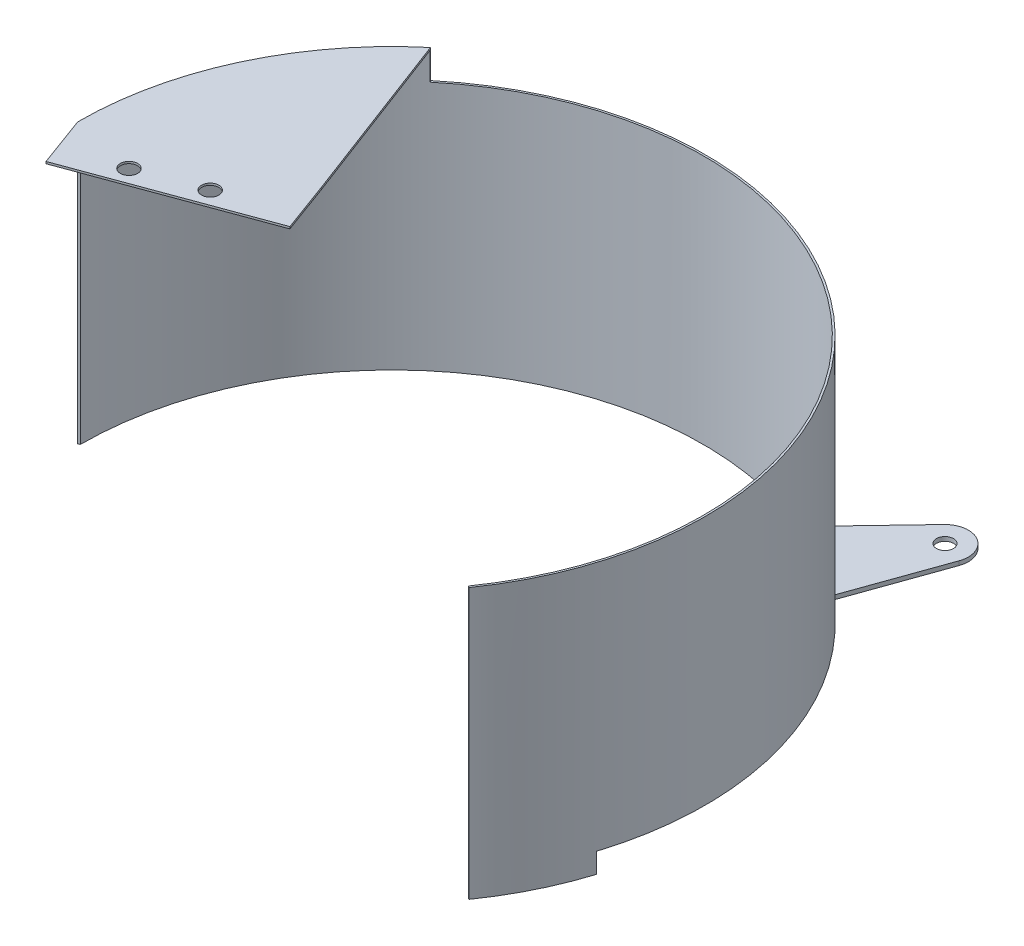
ISO-10303-21;
HEADER;
FILE_DESCRIPTION(('STEP AP214'),'2;1');
FILE_NAME('part.step','',(''),(''),'','','');
FILE_SCHEMA(('AUTOMOTIVE_DESIGN { 1 0 10303 214 1 1 1 1 }'));
ENDSEC;
DATA;
#1=APPLICATION_CONTEXT('core data for automotive mechanical design processes');
#2=APPLICATION_PROTOCOL_DEFINITION('international standard','automotive_design',2000,#1);
#3=PRODUCT_CONTEXT('',#1,'mechanical');
#4=PRODUCT('Part','Part','',(#3));
#5=PRODUCT_RELATED_PRODUCT_CATEGORY('part','',(#4));
#6=PRODUCT_DEFINITION_FORMATION('','',#4);
#7=PRODUCT_DEFINITION_CONTEXT('part definition',#1,'design');
#8=PRODUCT_DEFINITION('design','',#6,#7);
#9=PRODUCT_DEFINITION_SHAPE('','',#8);
#10=(LENGTH_UNIT() NAMED_UNIT(*) SI_UNIT(.MILLI.,.METRE.));
#11=(NAMED_UNIT(*) PLANE_ANGLE_UNIT() SI_UNIT($,.RADIAN.));
#12=(NAMED_UNIT(*) SI_UNIT($,.STERADIAN.) SOLID_ANGLE_UNIT());
#13=UNCERTAINTY_MEASURE_WITH_UNIT(LENGTH_MEASURE(1.E-05),#10,'distance_accuracy_value','');
#14=(GEOMETRIC_REPRESENTATION_CONTEXT(3) GLOBAL_UNCERTAINTY_ASSIGNED_CONTEXT((#13)) GLOBAL_UNIT_ASSIGNED_CONTEXT((#10,
#11,#12)) REPRESENTATION_CONTEXT('',''));
#15=CARTESIAN_POINT('',(0.,0.,0.));
#16=DIRECTION('',(0.,0.,1.));
#17=DIRECTION('',(1.,0.,0.));
#18=AXIS2_PLACEMENT_3D('',#15,#16,#17);
#19=CARTESIAN_POINT('',(-119.379693575983,7.61999999999996,0.2704842037125));
#20=DIRECTION('',(0.344827586206966,0.,0.938666040607988));
#21=DIRECTION('',(0.938666040607988,0.,-0.344827586206966));
#22=AXIS2_PLACEMENT_3D('',#19,#20,#21);
#23=PLANE('',#22);
#24=DIRECTION('',(0.,-1.,0.));
#25=VECTOR('',#24,1.);
#26=CARTESIAN_POINT('',(-118.6434,102.87,0.));
#27=LINE('',#26,#25);
#28=CARTESIAN_POINT('',(-118.6434,113.03,0.));
#29=VERTEX_POINT('',#28);
#30=CARTESIAN_POINT('',(-118.6434,7.61999999999996,0.));
#31=VERTEX_POINT('',#30);
#32=EDGE_CURVE('E345',#29,#31,#27,.T.);
#33=ORIENTED_EDGE('',*,*,#32,.F.);
#34=DIRECTION('',(0.938666040607988,0.,-0.344827586206966));
#35=VECTOR('',#34,1.);
#36=CARTESIAN_POINT('',(-119.379693575983,113.03,0.270484203712493));
#37=LINE('',#36,#35);
#38=CARTESIAN_POINT('',(-119.379693575983,113.03,0.2704842037125));
#39=VERTEX_POINT('',#38);
#40=EDGE_CURVE('E73',#39,#29,#37,.T.);
#41=ORIENTED_EDGE('',*,*,#40,.F.);
#42=DIRECTION('',(0.,1.,0.));
#43=VECTOR('',#42,1.);
#44=CARTESIAN_POINT('',(-119.379693575983,7.61999999999996,0.2704842037125));
#45=LINE('',#44,#43);
#46=CARTESIAN_POINT('',(-119.379693575983,7.61999999999996,0.2704842037125));
#47=VERTEX_POINT('',#46);
#48=EDGE_CURVE('E307',#47,#39,#45,.T.);
#49=ORIENTED_EDGE('',*,*,#48,.F.);
#50=DIRECTION('',(0.938666040607988,0.,-0.344827586206966));
#51=VECTOR('',#50,1.);
#52=CARTESIAN_POINT('',(-119.379693575983,7.61999999999996,0.2704842037125));
#53=LINE('',#52,#51);
#54=EDGE_CURVE('E303',#47,#31,#53,.T.);
#55=ORIENTED_EDGE('',*,*,#54,.T.);
#56=EDGE_LOOP('',(#33,#41,#49,#55));
#57=FACE_BOUND('',#56,.T.);
#58=ADVANCED_FACE('F46',(#57),#23,.T.);
#59=CARTESIAN_POINT('',(-8.68307739513456E-12,113.03,-4.05590009722013E-12));
#60=DIRECTION('',(0.,-1.,0.));
#61=DIRECTION('',(0.,0.,-1.));
#62=AXIS2_PLACEMENT_3D('',#59,#60,#61);
#63=PLANE('',#62);
#64=DIRECTION('',(-0.354304631179803,0.,-0.935130059577032));
#65=VECTOR('',#64,1.);
#66=CARTESIAN_POINT('',(-51.440692330775,113.03,-24.6875315284033));
#67=LINE('',#66,#65);
#68=CARTESIAN_POINT('',(-76.4594448936933,113.03,-90.7205029202786));
#69=VERTEX_POINT('',#68);
#70=CARTESIAN_POINT('',(-76.7359848443851,113.03,-91.4503856195385));
#71=VERTEX_POINT('',#70);
#72=EDGE_CURVE('E11',#69,#71,#67,.T.);
#73=ORIENTED_EDGE('',*,*,#72,.F.);
#74=CARTESIAN_POINT('',(-8.68307739513456E-12,113.03,-4.05590009722013E-12));
#75=DIRECTION('',(0.,-1.,0.));
#76=DIRECTION('',(0.,0.,-1.));
#77=AXIS2_PLACEMENT_3D('',#74,#75,#76);
#78=CIRCLE('',#77,118.643399999991);
#79=CARTESIAN_POINT('',(-76.26250749109,113.03,-90.8861172827371));
#80=VERTEX_POINT('',#79);
#81=EDGE_CURVE('E288',#69,#80,#78,.T.);
#82=ORIENTED_EDGE('',*,*,#81,.T.);
#83=DIRECTION('',(-0.642787609686567,0.,-0.766044443118955));
#84=VECTOR('',#83,1.);
#85=CARTESIAN_POINT('',(-76.7359848443851,113.03,-91.4503856195385));
#86=LINE('',#85,#84);
#87=EDGE_CURVE('E287',#80,#71,#86,.T.);
#88=ORIENTED_EDGE('',*,*,#87,.T.);
#89=EDGE_LOOP('',(#73,#82,#88));
#90=FACE_BOUND('',#89,.T.);
#91=ADVANCED_FACE('F406',(#90),#63,.F.);
#92=CARTESIAN_POINT('',(0.,102.87,0.));
#93=DIRECTION('',(0.,-1.,0.));
#94=DIRECTION('',(0.,0.,-1.));
#95=AXIS2_PLACEMENT_3D('',#92,#93,#94);
#96=CYLINDRICAL_SURFACE('',#95,118.6434);
#97=CARTESIAN_POINT('',(0.,7.62,0.));
#98=DIRECTION('',(0.,-1.,0.));
#99=DIRECTION('',(0.,0.,-1.));
#100=AXIS2_PLACEMENT_3D('',#97,#98,#99);
#101=CIRCLE('',#100,118.6434);
#102=CARTESIAN_POINT('',(113.152221674402,7.62,35.6767584529046));
#103=VERTEX_POINT('',#102);
#104=EDGE_CURVE('E326',#31,#103,#101,.T.);
#105=ORIENTED_EDGE('',*,*,#104,.T.);
#106=DIRECTION('',(0.,-1.,0.));
#107=VECTOR('',#106,1.);
#108=CARTESIAN_POINT('',(113.152221674402,7.62,35.6767584529046));
#109=LINE('',#108,#107);
#110=CARTESIAN_POINT('',(113.152221674402,0.,35.6767584529049));
#111=VERTEX_POINT('',#110);
#112=EDGE_CURVE('E310',#103,#111,#109,.T.);
#113=ORIENTED_EDGE('',*,*,#112,.T.);
#114=CARTESIAN_POINT('',(0.,0.,0.));
#115=DIRECTION('',(0.,1.,0.));
#116=DIRECTION('',(1.,0.,0.));
#117=AXIS2_PLACEMENT_3D('',#114,#115,#116);
#118=CIRCLE('',#117,118.6434);
#119=CARTESIAN_POINT('',(97.186983651397,0.,68.0510585685711));
#120=VERTEX_POINT('',#119);
#121=EDGE_CURVE('E330',#111,#120,#118,.F.);
#122=ORIENTED_EDGE('',*,*,#121,.T.);
#123=DIRECTION('',(0.,-1.,0.));
#124=VECTOR('',#123,1.);
#125=CARTESIAN_POINT('',(97.186983651397,102.87,68.0510585685711));
#126=LINE('',#125,#124);
#127=CARTESIAN_POINT('',(97.186983651397,102.87,68.0510585685711));
#128=VERTEX_POINT('',#127);
#129=EDGE_CURVE('E56',#128,#120,#126,.T.);
#130=ORIENTED_EDGE('',*,*,#129,.F.);
#131=CARTESIAN_POINT('',(0.,102.87,0.));
#132=DIRECTION('',(0.,1.,0.));
#133=DIRECTION('',(1.,0.,0.));
#134=AXIS2_PLACEMENT_3D('',#131,#132,#133);
#135=CIRCLE('',#134,118.6434);
#136=CARTESIAN_POINT('',(-76.26250749109,102.87,-90.8861172827371));
#137=VERTEX_POINT('',#136);
#138=EDGE_CURVE('E334',#137,#128,#135,.F.);
#139=ORIENTED_EDGE('',*,*,#138,.F.);
#140=DIRECTION('',(0.,-1.,0.));
#141=VECTOR('',#140,1.);
#142=CARTESIAN_POINT('',(-76.26250749109,113.03,-90.8861172827371));
#143=LINE('',#142,#141);
#144=EDGE_CURVE('E299',#80,#137,#143,.T.);
#145=ORIENTED_EDGE('',*,*,#144,.F.);
#146=ORIENTED_EDGE('',*,*,#81,.F.);
#147=EDGE_CURVE('E283',#29,#69,#78,.T.);
#148=ORIENTED_EDGE('',*,*,#147,.F.);
#149=ORIENTED_EDGE('',*,*,#32,.T.);
#150=EDGE_LOOP('',(#105,#113,#122,#130,#139,#145,#146,#148,#149));
#151=FACE_BOUND('',#150,.T.);
#152=ADVANCED_FACE('F48',(#151),#96,.F.);
#153=CARTESIAN_POINT('',(0.,102.87,0.));
#154=DIRECTION('',(0.,-1.,0.));
#155=DIRECTION('',(0.,0.,-1.));
#156=AXIS2_PLACEMENT_3D('',#153,#154,#155);
#157=CYLINDRICAL_SURFACE('',#156,119.38);
#158=DIRECTION('',(0.,-1.,0.));
#159=VECTOR('',#158,1.);
#160=CARTESIAN_POINT('',(76.0548796235913,9.2075,-92.0176053015999));
#161=LINE('',#160,#159);
#162=CARTESIAN_POINT('',(76.0548796235913,9.2075,-92.0176053015999));
#163=VERTEX_POINT('',#162);
#164=CARTESIAN_POINT('',(76.0548796235913,7.62,-92.0176053015999));
#165=VERTEX_POINT('',#164);
#166=EDGE_CURVE('E194',#163,#165,#161,.T.);
#167=ORIENTED_EDGE('',*,*,#166,.F.);
#168=CARTESIAN_POINT('',(0.,9.2075,0.));
#169=DIRECTION('',(0.,1.,0.));
#170=DIRECTION('',(0.,0.,-1.));
#171=AXIS2_PLACEMENT_3D('',#168,#169,#170);
#172=CIRCLE('',#171,119.38);
#173=CARTESIAN_POINT('',(47.938477771701,9.2075,-109.332002400633));
#174=VERTEX_POINT('',#173);
#175=EDGE_CURVE('E185',#163,#174,#172,.T.);
#176=ORIENTED_EDGE('',*,*,#175,.T.);
#177=DIRECTION('',(0.,-1.,0.));
#178=VECTOR('',#177,1.);
#179=CARTESIAN_POINT('',(47.938477771701,9.2075,-109.332002400633));
#180=LINE('',#179,#178);
#181=CARTESIAN_POINT('',(47.938477771701,7.62,-109.332002400633));
#182=VERTEX_POINT('',#181);
#183=EDGE_CURVE('E168',#174,#182,#180,.T.);
#184=ORIENTED_EDGE('',*,*,#183,.T.);
#185=CARTESIAN_POINT('',(0.,7.62,0.));
#186=DIRECTION('',(0.,-1.,0.));
#187=DIRECTION('',(0.,0.,-1.));
#188=AXIS2_PLACEMENT_3D('',#185,#186,#187);
#189=CIRCLE('',#188,119.38);
#190=EDGE_CURVE('E331',#47,#182,#189,.T.);
#191=ORIENTED_EDGE('',*,*,#190,.F.);
#192=ORIENTED_EDGE('',*,*,#48,.T.);
#193=DIRECTION('',(0.,-1.,0.));
#194=VECTOR('',#193,1.);
#195=CARTESIAN_POINT('',(-119.379693575983,113.792,0.270484203712493));
#196=LINE('',#195,#194);
#197=CARTESIAN_POINT('',(-119.379693575983,113.792,0.2704842037125));
#198=VERTEX_POINT('',#197);
#199=EDGE_CURVE('E244',#198,#39,#196,.T.);
#200=ORIENTED_EDGE('',*,*,#199,.F.);
#201=CARTESIAN_POINT('',(-8.00748356510894E-12,113.792,-3.740063814206E-12));
#202=DIRECTION('',(0.,1.,0.));
#203=DIRECTION('',(0.,0.,-1.));
#204=AXIS2_PLACEMENT_3D('',#201,#202,#203);
#205=CIRCLE('',#204,119.379999999992);
#206=CARTESIAN_POINT('',(-76.7359848443851,113.792,-91.4503856195385));
#207=VERTEX_POINT('',#206);
#208=EDGE_CURVE('E265',#207,#198,#205,.T.);
#209=ORIENTED_EDGE('',*,*,#208,.F.);
#210=DIRECTION('',(0.,-1.,0.));
#211=VECTOR('',#210,1.);
#212=CARTESIAN_POINT('',(-76.7359848443851,113.792,-91.4503856195385));
#213=LINE('',#212,#211);
#214=EDGE_CURVE('E271',#207,#71,#213,.T.);
#215=ORIENTED_EDGE('',*,*,#214,.T.);
#216=DIRECTION('',(0.,-1.,0.));
#217=VECTOR('',#216,1.);
#218=CARTESIAN_POINT('',(-76.7359848443851,113.03,-91.4503856195385));
#219=LINE('',#218,#217);
#220=CARTESIAN_POINT('',(-76.7359848443851,102.87,-91.4503856195385));
#221=VERTEX_POINT('',#220);
#222=EDGE_CURVE('E292',#71,#221,#219,.T.);
#223=ORIENTED_EDGE('',*,*,#222,.T.);
#224=CARTESIAN_POINT('',(0.,102.87,0.));
#225=DIRECTION('',(0.,-1.,0.));
#226=DIRECTION('',(0.,0.,-1.));
#227=AXIS2_PLACEMENT_3D('',#224,#225,#226);
#228=CIRCLE('',#227,119.38);
#229=CARTESIAN_POINT('',(97.7903710472203,102.87,68.4735549715873));
#230=VERTEX_POINT('',#229);
#231=EDGE_CURVE('E342',#221,#230,#228,.T.);
#232=ORIENTED_EDGE('',*,*,#231,.T.);
#233=DIRECTION('',(0.,-1.,0.));
#234=VECTOR('',#233,1.);
#235=CARTESIAN_POINT('',(97.7903710472203,102.87,68.4735549715873));
#236=LINE('',#235,#234);
#237=CARTESIAN_POINT('',(97.7903710472203,0.,68.4735549715873));
#238=VERTEX_POINT('',#237);
#239=EDGE_CURVE('E356',#230,#238,#236,.T.);
#240=ORIENTED_EDGE('',*,*,#239,.T.);
#241=CARTESIAN_POINT('',(0.,0.,0.));
#242=DIRECTION('',(0.,-1.,0.));
#243=DIRECTION('',(0.,0.,-1.));
#244=AXIS2_PLACEMENT_3D('',#241,#242,#243);
#245=CIRCLE('',#244,119.38);
#246=CARTESIAN_POINT('',(113.854729580324,0.,35.8982583448194));
#247=VERTEX_POINT('',#246);
#248=EDGE_CURVE('E338',#247,#238,#245,.T.);
#249=ORIENTED_EDGE('',*,*,#248,.F.);
#250=DIRECTION('',(0.,-1.,0.));
#251=VECTOR('',#250,1.);
#252=CARTESIAN_POINT('',(113.854729580324,102.87,35.8982583448194));
#253=LINE('',#252,#251);
#254=CARTESIAN_POINT('',(113.854729580324,7.62,35.8982583448194));
#255=VERTEX_POINT('',#254);
#256=EDGE_CURVE('E311',#255,#247,#253,.T.);
#257=ORIENTED_EDGE('',*,*,#256,.F.);
#258=EDGE_CURVE('E322',#165,#255,#189,.T.);
#259=ORIENTED_EDGE('',*,*,#258,.F.);
#260=EDGE_LOOP('',(#167,#176,#184,#191,#192,#200,#209,#215,#223,#232,#240,#249,#257,#259));
#261=FACE_BOUND('',#260,.T.);
#262=ADVANCED_FACE('F192',(#261),#157,.T.);
#263=CARTESIAN_POINT('',(0.,0.,0.));
#264=DIRECTION('',(0.,1.,0.));
#265=DIRECTION('',(1.,0.,0.));
#266=AXIS2_PLACEMENT_3D('',#263,#264,#265);
#267=PLANE('',#266);
#268=DIRECTION('',(-0.953716950748228,0.,-0.30070579950427));
#269=VECTOR('',#268,1.);
#270=CARTESIAN_POINT('',(113.152221674402,0.,35.6767584529049));
#271=LINE('',#270,#269);
#272=EDGE_CURVE('E318',#111,#247,#271,.F.);
#273=ORIENTED_EDGE('',*,*,#272,.T.);
#274=ORIENTED_EDGE('',*,*,#248,.T.);
#275=DIRECTION('',(-0.819152044289029,0.,-0.573576436350992));
#276=VECTOR('',#275,1.);
#277=CARTESIAN_POINT('',(97.7903710472203,0.,68.4735549715873));
#278=LINE('',#277,#276);
#279=EDGE_CURVE('E348',#238,#120,#278,.T.);
#280=ORIENTED_EDGE('',*,*,#279,.T.);
#281=ORIENTED_EDGE('',*,*,#121,.F.);
#282=EDGE_LOOP('',(#273,#274,#280,#281));
#283=FACE_BOUND('',#282,.T.);
#284=ADVANCED_FACE('F422',(#283),#267,.F.);
#285=CARTESIAN_POINT('',(97.7903710472203,102.87,68.4735549715873));
#286=DIRECTION('',(-0.573576436350992,0.,0.81915204428903));
#287=DIRECTION('',(0.81915204428903,0.,0.573576436350992));
#288=AXIS2_PLACEMENT_3D('',#285,#286,#287);
#289=PLANE('',#288);
#290=ORIENTED_EDGE('',*,*,#279,.F.);
#291=ORIENTED_EDGE('',*,*,#239,.F.);
#292=DIRECTION('',(-0.819152044289029,0.,-0.573576436350992));
#293=VECTOR('',#292,1.);
#294=CARTESIAN_POINT('',(97.7903710472203,102.87,68.4735549715873));
#295=LINE('',#294,#293);
#296=EDGE_CURVE('E337',#230,#128,#295,.T.);
#297=ORIENTED_EDGE('',*,*,#296,.T.);
#298=ORIENTED_EDGE('',*,*,#129,.T.);
#299=EDGE_LOOP('',(#290,#291,#297,#298));
#300=FACE_BOUND('',#299,.T.);
#301=ADVANCED_FACE('F418',(#300),#289,.T.);
#302=CARTESIAN_POINT('',(0.,102.87,0.));
#303=DIRECTION('',(0.,1.,0.));
#304=DIRECTION('',(1.,0.,0.));
#305=AXIS2_PLACEMENT_3D('',#302,#303,#304);
#306=PLANE('',#305);
#307=DIRECTION('',(-0.642787609686567,0.,-0.766044443118955));
#308=VECTOR('',#307,1.);
#309=CARTESIAN_POINT('',(-76.7359848443851,102.87,-91.4503856195385));
#310=LINE('',#309,#308);
#311=EDGE_CURVE('E282',#137,#221,#310,.T.);
#312=ORIENTED_EDGE('',*,*,#311,.F.);
#313=ORIENTED_EDGE('',*,*,#138,.T.);
#314=ORIENTED_EDGE('',*,*,#296,.F.);
#315=ORIENTED_EDGE('',*,*,#231,.F.);
#316=EDGE_LOOP('',(#312,#313,#314,#315));
#317=FACE_BOUND('',#316,.T.);
#318=ADVANCED_FACE('F415',(#317),#306,.T.);
#319=CARTESIAN_POINT('',(0.,7.62,0.));
#320=DIRECTION('',(0.,1.,0.));
#321=DIRECTION('',(0.,0.,1.));
#322=AXIS2_PLACEMENT_3D('',#319,#320,#321);
#323=PLANE('',#322);
#324=ORIENTED_EDGE('',*,*,#104,.F.);
#325=ORIENTED_EDGE('',*,*,#54,.F.);
#326=ORIENTED_EDGE('',*,*,#190,.T.);
#327=DIRECTION('',(0.690007892958849,0.,-0.723801842809542));
#328=VECTOR('',#327,1.);
#329=CARTESIAN_POINT('',(73.8609896705439,7.62,-136.524099873863));
#330=LINE('',#329,#328);
#331=CARTESIAN_POINT('',(73.8609896705439,7.62,-136.524099873863));
#332=VERTEX_POINT('',#331);
#333=EDGE_CURVE('E173',#182,#332,#330,.T.);
#334=ORIENTED_EDGE('',*,*,#333,.T.);
#335=CARTESIAN_POINT('',(80.2955880531208,7.62,-130.389929705459));
#336=DIRECTION('',(0.,-1.,0.));
#337=DIRECTION('',(0.,0.,1.));
#338=AXIS2_PLACEMENT_3D('',#335,#336,#337);
#339=CIRCLE('',#338,8.89);
#340=CARTESIAN_POINT('',(88.6694516172861,7.62,-127.404882133184));
#341=VERTEX_POINT('',#340);
#342=EDGE_CURVE('E199',#332,#341,#339,.T.);
#343=ORIENTED_EDGE('',*,*,#342,.T.);
#344=DIRECTION('',(-0.335775879895944,0.,0.94194190823007));
#345=VECTOR('',#344,1.);
#346=CARTESIAN_POINT('',(76.0548796235913,7.62,-92.0176053015999));
#347=LINE('',#346,#345);
#348=EDGE_CURVE('E65',#341,#165,#347,.T.);
#349=ORIENTED_EDGE('',*,*,#348,.T.);
#350=ORIENTED_EDGE('',*,*,#258,.T.);
#351=DIRECTION('',(-0.953716950748229,0.,-0.300705799504267));
#352=VECTOR('',#351,1.);
#353=CARTESIAN_POINT('',(113.152221674402,7.62,35.6767584529046));
#354=LINE('',#353,#352);
#355=EDGE_CURVE('E314',#103,#255,#354,.F.);
#356=ORIENTED_EDGE('',*,*,#355,.F.);
#357=EDGE_LOOP('',(#324,#325,#326,#334,#343,#349,#350,#356));
#358=FACE_BOUND('',#357,.T.);
#359=CARTESIAN_POINT('',(80.2955880531208,7.62,-130.389929705459));
#360=DIRECTION('',(0.,-1.,0.));
#361=DIRECTION('',(0.,0.,-1.));
#362=AXIS2_PLACEMENT_3D('',#359,#360,#361);
#363=CIRCLE('',#362,3.26389999999999);
#364=CARTESIAN_POINT('',(80.2955880531208,7.62,-133.653829705459));
#365=VERTEX_POINT('',#364);
#366=EDGE_CURVE('E202',#365,#365,#363,.T.);
#367=ORIENTED_EDGE('',*,*,#366,.F.);
#368=EDGE_LOOP('',(#367));
#369=FACE_BOUND('',#368,.T.);
#370=ADVANCED_FACE('F429',(#358,#369),#323,.F.);
#371=CARTESIAN_POINT('',(113.152221674402,3.81,35.6767584529046));
#372=DIRECTION('',(-0.300705799504267,0.,0.953716950748229));
#373=DIRECTION('',(0.,-1.,0.));
#374=AXIS2_PLACEMENT_3D('',#371,#372,#373);
#375=PLANE('',#374);
#376=ORIENTED_EDGE('',*,*,#272,.F.);
#377=ORIENTED_EDGE('',*,*,#112,.F.);
#378=ORIENTED_EDGE('',*,*,#355,.T.);
#379=ORIENTED_EDGE('',*,*,#256,.T.);
#380=EDGE_LOOP('',(#376,#377,#378,#379));
#381=FACE_BOUND('',#380,.T.);
#382=ADVANCED_FACE('F425',(#381),#375,.F.);
#383=CARTESIAN_POINT('',(-76.7359848443851,113.03,-91.4503856195385));
#384=DIRECTION('',(-0.766044443118955,0.,0.642787609686567));
#385=DIRECTION('',(0.642787609686567,0.,0.766044443118955));
#386=AXIS2_PLACEMENT_3D('',#383,#384,#385);
#387=PLANE('',#386);
#388=ORIENTED_EDGE('',*,*,#311,.T.);
#389=ORIENTED_EDGE('',*,*,#222,.F.);
#390=ORIENTED_EDGE('',*,*,#87,.F.);
#391=ORIENTED_EDGE('',*,*,#144,.T.);
#392=EDGE_LOOP('',(#388,#389,#390,#391));
#393=FACE_BOUND('',#392,.T.);
#394=ADVANCED_FACE('F404',(#393),#387,.F.);
#395=CARTESIAN_POINT('',(-51.440692330775,113.792,-24.6875315284033));
#396=DIRECTION('',(-0.935130059577032,0.,0.354304631179803));
#397=DIRECTION('',(0.354304631179803,0.,0.935130059577032));
#398=AXIS2_PLACEMENT_3D('',#395,#396,#397);
#399=PLANE('',#398);
#400=CARTESIAN_POINT('',(-51.440692330775,113.03,-24.6875315284033));
#401=VERTEX_POINT('',#400);
#402=EDGE_CURVE('E58',#401,#69,#67,.T.);
#403=ORIENTED_EDGE('',*,*,#402,.T.);
#404=ORIENTED_EDGE('',*,*,#72,.T.);
#405=ORIENTED_EDGE('',*,*,#214,.F.);
#406=DIRECTION('',(-0.354304631179803,0.,-0.935130059577032));
#407=VECTOR('',#406,1.);
#408=CARTESIAN_POINT('',(-51.440692330775,113.792,-24.6875315284033));
#409=LINE('',#408,#407);
#410=CARTESIAN_POINT('',(-51.440692330775,113.792,-24.6875315284033));
#411=VERTEX_POINT('',#410);
#412=EDGE_CURVE('E269',#411,#207,#409,.T.);
#413=ORIENTED_EDGE('',*,*,#412,.F.);
#414=DIRECTION('',(0.,-1.,0.));
#415=VECTOR('',#414,1.);
#416=CARTESIAN_POINT('',(-51.440692330775,113.792,-24.6875315284033));
#417=LINE('',#416,#415);
#418=EDGE_CURVE('E278',#411,#401,#417,.T.);
#419=ORIENTED_EDGE('',*,*,#418,.T.);
#420=EDGE_LOOP('',(#403,#404,#405,#413,#419));
#421=FACE_BOUND('',#420,.T.);
#422=ADVANCED_FACE('F387',(#421),#399,.F.);
#423=CARTESIAN_POINT('',(-8.00748356510894E-12,113.792,-3.740063814206E-12));
#424=DIRECTION('',(0.,-1.,0.));
#425=DIRECTION('',(0.,0.,-1.));
#426=AXIS2_PLACEMENT_3D('',#423,#424,#425);
#427=PLANE('',#426);
#428=CARTESIAN_POINT('',(-94.2586622610647,113.792,5.86092858076518));
#429=DIRECTION('',(0.,1.,0.));
#430=DIRECTION('',(0.,0.,1.));
#431=AXIS2_PLACEMENT_3D('',#428,#429,#430);
#432=CIRCLE('',#431,3.30000000000001);
#433=CARTESIAN_POINT('',(-94.2586622610647,113.792,9.16092858076519));
#434=VERTEX_POINT('',#433);
#435=EDGE_CURVE('E222',#434,#434,#432,.T.);
#436=ORIENTED_EDGE('',*,*,#435,.F.);
#437=EDGE_LOOP('',(#436));
#438=FACE_BOUND('',#437,.T.);
#439=CARTESIAN_POINT('',(-71.6339672349805,113.792,-2.45049328494983));
#440=DIRECTION('',(0.,1.,0.));
#441=DIRECTION('',(0.,0.,1.));
#442=AXIS2_PLACEMENT_3D('',#439,#440,#441);
#443=CIRCLE('',#442,3.29999999999999);
#444=CARTESIAN_POINT('',(-71.6339672349805,113.792,0.849506715050158));
#445=VERTEX_POINT('',#444);
#446=EDGE_CURVE('E216',#445,#445,#443,.T.);
#447=ORIENTED_EDGE('',*,*,#446,.F.);
#448=EDGE_LOOP('',(#447));
#449=FACE_BOUND('',#448,.T.);
#450=ORIENTED_EDGE('',*,*,#208,.T.);
#451=DIRECTION('',(-0.344827586206966,0.,-0.938666040607989));
#452=VECTOR('',#451,1.);
#453=CARTESIAN_POINT('',(-112.366400603568,113.792,19.361590047227));
#454=LINE('',#453,#452);
#455=CARTESIAN_POINT('',(-112.366400603568,113.792,19.361590047227));
#456=VERTEX_POINT('',#455);
#457=EDGE_CURVE('E243',#456,#198,#454,.T.);
#458=ORIENTED_EDGE('',*,*,#457,.F.);
#459=DIRECTION('',(-0.938666040607988,0.,0.344827586206966));
#460=VECTOR('',#459,1.);
#461=CARTESIAN_POINT('',(-112.366400603568,113.792,19.361590047227));
#462=LINE('',#461,#460);
#463=CARTESIAN_POINT('',(-44.4273993583598,113.792,-5.59642568488879));
#464=VERTEX_POINT('',#463);
#465=EDGE_CURVE('E240',#464,#456,#462,.T.);
#466=ORIENTED_EDGE('',*,*,#465,.F.);
#467=DIRECTION('',(-0.344827586206966,0.,-0.938666040607989));
#468=VECTOR('',#467,1.);
#469=CARTESIAN_POINT('',(-44.4273993583598,113.792,-5.59642568488879));
#470=LINE('',#469,#468);
#471=EDGE_CURVE('E253',#464,#411,#470,.T.);
#472=ORIENTED_EDGE('',*,*,#471,.T.);
#473=ORIENTED_EDGE('',*,*,#412,.T.);
#474=EDGE_LOOP('',(#450,#458,#466,#472,#473));
#475=FACE_BOUND('',#474,.T.);
#476=ADVANCED_FACE('F379',(#438,#449,#475),#427,.F.);
#477=CARTESIAN_POINT('',(-8.00748356510894E-12,113.03,-3.740063814206E-12));
#478=DIRECTION('',(0.,-1.,0.));
#479=DIRECTION('',(0.,0.,-1.));
#480=AXIS2_PLACEMENT_3D('',#477,#478,#479);
#481=PLANE('',#480);
#482=CARTESIAN_POINT('',(-94.2586622610647,113.03,5.86092858076518));
#483=DIRECTION('',(0.,-1.,0.));
#484=DIRECTION('',(0.,0.,-1.));
#485=AXIS2_PLACEMENT_3D('',#482,#483,#484);
#486=CIRCLE('',#485,3.30000000000001);
#487=CARTESIAN_POINT('',(-94.2586622610647,113.03,9.16092858076519));
#488=VERTEX_POINT('',#487);
#489=EDGE_CURVE('E50',#488,#488,#486,.T.);
#490=ORIENTED_EDGE('',*,*,#489,.F.);
#491=EDGE_LOOP('',(#490));
#492=FACE_BOUND('',#491,.T.);
#493=CARTESIAN_POINT('',(-71.6339672349805,113.03,-2.45049328494983));
#494=DIRECTION('',(0.,-1.,0.));
#495=DIRECTION('',(0.,0.,-1.));
#496=AXIS2_PLACEMENT_3D('',#493,#494,#495);
#497=CIRCLE('',#496,3.29999999999999);
#498=CARTESIAN_POINT('',(-71.6339672349805,113.03,0.849506715050158));
#499=VERTEX_POINT('',#498);
#500=EDGE_CURVE('E226',#499,#499,#497,.T.);
#501=ORIENTED_EDGE('',*,*,#500,.F.);
#502=EDGE_LOOP('',(#501));
#503=FACE_BOUND('',#502,.T.);
#504=ORIENTED_EDGE('',*,*,#402,.F.);
#505=DIRECTION('',(-0.344827586206966,0.,-0.938666040607989));
#506=VECTOR('',#505,1.);
#507=CARTESIAN_POINT('',(-44.4273993583598,113.03,-5.59642568488879));
#508=LINE('',#507,#506);
#509=CARTESIAN_POINT('',(-44.4273993583598,113.03,-5.59642568488879));
#510=VERTEX_POINT('',#509);
#511=EDGE_CURVE('E257',#510,#401,#508,.T.);
#512=ORIENTED_EDGE('',*,*,#511,.F.);
#513=DIRECTION('',(0.938666040607988,0.,-0.344827586206966));
#514=VECTOR('',#513,1.);
#515=CARTESIAN_POINT('',(-112.366400603568,113.03,19.361590047227));
#516=LINE('',#515,#514);
#517=CARTESIAN_POINT('',(-112.366400603568,113.03,19.361590047227));
#518=VERTEX_POINT('',#517);
#519=EDGE_CURVE('E234',#518,#510,#516,.T.);
#520=ORIENTED_EDGE('',*,*,#519,.F.);
#521=DIRECTION('',(-0.344827586206966,0.,-0.938666040607989));
#522=VECTOR('',#521,1.);
#523=CARTESIAN_POINT('',(-112.366400603568,113.03,19.361590047227));
#524=LINE('',#523,#522);
#525=EDGE_CURVE('E261',#518,#39,#524,.T.);
#526=ORIENTED_EDGE('',*,*,#525,.T.);
#527=ORIENTED_EDGE('',*,*,#40,.T.);
#528=ORIENTED_EDGE('',*,*,#147,.T.);
#529=EDGE_LOOP('',(#504,#512,#520,#526,#527,#528));
#530=FACE_BOUND('',#529,.T.);
#531=ADVANCED_FACE('F375',(#492,#503,#530),#481,.T.);
#532=CARTESIAN_POINT('',(-112.366400603568,113.792,19.361590047227));
#533=DIRECTION('',(0.938666040607989,0.,-0.344827586206966));
#534=DIRECTION('',(-0.344827586206966,0.,-0.938666040607989));
#535=AXIS2_PLACEMENT_3D('',#532,#533,#534);
#536=PLANE('',#535);
#537=ORIENTED_EDGE('',*,*,#199,.T.);
#538=ORIENTED_EDGE('',*,*,#525,.F.);
#539=DIRECTION('',(0.,-1.,0.));
#540=VECTOR('',#539,1.);
#541=CARTESIAN_POINT('',(-112.366400603568,113.792,19.361590047227));
#542=LINE('',#541,#540);
#543=EDGE_CURVE('E230',#456,#518,#542,.T.);
#544=ORIENTED_EDGE('',*,*,#543,.F.);
#545=ORIENTED_EDGE('',*,*,#457,.T.);
#546=EDGE_LOOP('',(#537,#538,#544,#545));
#547=FACE_BOUND('',#546,.T.);
#548=ADVANCED_FACE('F378',(#547),#536,.F.);
#549=CARTESIAN_POINT('',(-44.4273993583598,113.792,-5.59642568488879));
#550=DIRECTION('',(-0.938666040607989,0.,0.344827586206966));
#551=DIRECTION('',(0.344827586206966,0.,0.938666040607989));
#552=AXIS2_PLACEMENT_3D('',#549,#550,#551);
#553=PLANE('',#552);
#554=ORIENTED_EDGE('',*,*,#418,.F.);
#555=ORIENTED_EDGE('',*,*,#471,.F.);
#556=DIRECTION('',(0.,1.,0.));
#557=VECTOR('',#556,1.);
#558=CARTESIAN_POINT('',(-44.4273993583598,113.792,-5.59642568488879));
#559=LINE('',#558,#557);
#560=EDGE_CURVE('E237',#510,#464,#559,.T.);
#561=ORIENTED_EDGE('',*,*,#560,.F.);
#562=ORIENTED_EDGE('',*,*,#511,.T.);
#563=EDGE_LOOP('',(#554,#555,#561,#562));
#564=FACE_BOUND('',#563,.T.);
#565=ADVANCED_FACE('F391',(#564),#553,.F.);
#566=CARTESIAN_POINT('',(-7.09412676599711,0.,-19.3111460607242));
#567=DIRECTION('',(0.344827586206966,0.,0.938666040607989));
#568=DIRECTION('',(0.938666040607989,0.,-0.344827586206966));
#569=AXIS2_PLACEMENT_3D('',#566,#567,#568);
#570=PLANE('',#569);
#571=ORIENTED_EDGE('',*,*,#543,.T.);
#572=ORIENTED_EDGE('',*,*,#519,.T.);
#573=ORIENTED_EDGE('',*,*,#560,.T.);
#574=ORIENTED_EDGE('',*,*,#465,.T.);
#575=EDGE_LOOP('',(#571,#572,#573,#574));
#576=FACE_BOUND('',#575,.T.);
#577=ADVANCED_FACE('F394',(#576),#570,.T.);
#578=CARTESIAN_POINT('',(-71.6339672349805,0.,-2.45049328494983));
#579=DIRECTION('',(0.,1.,0.));
#580=DIRECTION('',(0.,0.,1.));
#581=AXIS2_PLACEMENT_3D('',#578,#579,#580);
#582=CYLINDRICAL_SURFACE('',#581,3.29999999999999);
#583=CARTESIAN_POINT('',(-71.6339672349805,113.03,0.849506715050158));
#584=CARTESIAN_POINT('',(-71.6339672349805,113.0379375,0.849506715050158));
#585=CARTESIAN_POINT('',(-71.6339672349805,113.045875,0.849506715050158));
#586=CARTESIAN_POINT('',(-71.6339672349805,113.06175,0.849506715050158));
#587=CARTESIAN_POINT('',(-71.6339672349805,113.0696875,0.849506715050158));
#588=CARTESIAN_POINT('',(-71.6339672349805,113.0855625,0.849506715050158));
#589=CARTESIAN_POINT('',(-71.6339672349805,113.0935,0.849506715050158));
#590=CARTESIAN_POINT('',(-71.6339672349805,113.109375,0.849506715050158));
#591=CARTESIAN_POINT('',(-71.6339672349805,113.1173125,0.849506715050158));
#592=CARTESIAN_POINT('',(-71.6339672349805,113.1331875,0.849506715050158));
#593=CARTESIAN_POINT('',(-71.6339672349805,113.141125,0.849506715050158));
#594=CARTESIAN_POINT('',(-71.6339672349805,113.157,0.849506715050158));
#595=CARTESIAN_POINT('',(-71.6339672349805,113.1649375,0.849506715050158));
#596=CARTESIAN_POINT('',(-71.6339672349805,113.1808125,0.849506715050158));
#597=CARTESIAN_POINT('',(-71.6339672349805,113.18875,0.849506715050158));
#598=CARTESIAN_POINT('',(-71.6339672349805,113.204625,0.849506715050158));
#599=CARTESIAN_POINT('',(-71.6339672349805,113.2125625,0.849506715050158));
#600=CARTESIAN_POINT('',(-71.6339672349805,113.2284375,0.849506715050158));
#601=CARTESIAN_POINT('',(-71.6339672349805,113.236375,0.849506715050158));
#602=CARTESIAN_POINT('',(-71.6339672349805,113.25225,0.849506715050158));
#603=CARTESIAN_POINT('',(-71.6339672349805,113.2601875,0.849506715050158));
#604=CARTESIAN_POINT('',(-71.6339672349805,113.2760625,0.849506715050158));
#605=CARTESIAN_POINT('',(-71.6339672349805,113.284,0.849506715050158));
#606=CARTESIAN_POINT('',(-71.6339672349805,113.299875,0.849506715050158));
#607=CARTESIAN_POINT('',(-71.6339672349805,113.3078125,0.849506715050158));
#608=CARTESIAN_POINT('',(-71.6339672349805,113.3236875,0.849506715050158));
#609=CARTESIAN_POINT('',(-71.6339672349805,113.331625,0.849506715050158));
#610=CARTESIAN_POINT('',(-71.6339672349805,113.3475,0.849506715050158));
#611=CARTESIAN_POINT('',(-71.6339672349805,113.3554375,0.849506715050158));
#612=CARTESIAN_POINT('',(-71.6339672349805,113.3713125,0.849506715050158));
#613=CARTESIAN_POINT('',(-71.6339672349805,113.37925,0.849506715050158));
#614=CARTESIAN_POINT('',(-71.6339672349805,113.395125,0.849506715050158));
#615=CARTESIAN_POINT('',(-71.6339672349805,113.4030625,0.849506715050158));
#616=CARTESIAN_POINT('',(-71.6339672349805,113.4189375,0.849506715050158));
#617=CARTESIAN_POINT('',(-71.6339672349805,113.426875,0.849506715050158));
#618=CARTESIAN_POINT('',(-71.6339672349805,113.44275,0.849506715050158));
#619=CARTESIAN_POINT('',(-71.6339672349805,113.4506875,0.849506715050158));
#620=CARTESIAN_POINT('',(-71.6339672349805,113.4665625,0.849506715050158));
#621=CARTESIAN_POINT('',(-71.6339672349805,113.4745,0.849506715050158));
#622=CARTESIAN_POINT('',(-71.6339672349805,113.490375,0.849506715050158));
#623=CARTESIAN_POINT('',(-71.6339672349805,113.4983125,0.849506715050158));
#624=CARTESIAN_POINT('',(-71.6339672349805,113.5141875,0.849506715050158));
#625=CARTESIAN_POINT('',(-71.6339672349805,113.522125,0.849506715050158));
#626=CARTESIAN_POINT('',(-71.6339672349805,113.538,0.849506715050158));
#627=CARTESIAN_POINT('',(-71.6339672349805,113.5459375,0.849506715050158));
#628=CARTESIAN_POINT('',(-71.6339672349805,113.5618125,0.849506715050158));
#629=CARTESIAN_POINT('',(-71.6339672349805,113.56975,0.849506715050158));
#630=CARTESIAN_POINT('',(-71.6339672349805,113.585625,0.849506715050158));
#631=CARTESIAN_POINT('',(-71.6339672349805,113.5935625,0.849506715050158));
#632=CARTESIAN_POINT('',(-71.6339672349805,113.6094375,0.849506715050158));
#633=CARTESIAN_POINT('',(-71.6339672349805,113.617375,0.849506715050158));
#634=CARTESIAN_POINT('',(-71.6339672349805,113.63325,0.849506715050158));
#635=CARTESIAN_POINT('',(-71.6339672349805,113.6411875,0.849506715050158));
#636=CARTESIAN_POINT('',(-71.6339672349805,113.6570625,0.849506715050158));
#637=CARTESIAN_POINT('',(-71.6339672349805,113.665,0.849506715050158));
#638=CARTESIAN_POINT('',(-71.6339672349805,113.680875,0.849506715050158));
#639=CARTESIAN_POINT('',(-71.6339672349805,113.6888125,0.849506715050158));
#640=CARTESIAN_POINT('',(-71.6339672349805,113.7046875,0.849506715050158));
#641=CARTESIAN_POINT('',(-71.6339672349805,113.712625,0.849506715050158));
#642=CARTESIAN_POINT('',(-71.6339672349805,113.7285,0.849506715050158));
#643=CARTESIAN_POINT('',(-71.6339672349805,113.7364375,0.849506715050158));
#644=CARTESIAN_POINT('',(-71.6339672349805,113.7523125,0.849506715050158));
#645=CARTESIAN_POINT('',(-71.6339672349805,113.76025,0.849506715050158));
#646=CARTESIAN_POINT('',(-71.6339672349805,113.776125,0.849506715050158));
#647=CARTESIAN_POINT('',(-71.6339672349805,113.7840625,0.849506715050158));
#648=CARTESIAN_POINT('',(-71.6339672349805,113.792,0.849506715050158));
#649=B_SPLINE_CURVE_WITH_KNOTS('',3,(#583,#584,#585,#586,#587,#588,#589,#590,#591,#592,#593,
#594,#595,#596,#597,#598,#599,#600,#601,#602,#603,#604,#605,#606,#607,#608,#609,#610,#611,#612,
#613,#614,#615,#616,#617,#618,#619,#620,#621,#622,#623,#624,#625,#626,#627,#628,#629,#630,#631,
#632,#633,#634,#635,#636,#637,#638,#639,#640,#641,#642,#643,#644,#645,#646,#647,#648),
.UNSPECIFIED.,.F.,.F.,(4,2,2,2,2,2,2,2,2,2,2,2,2,2,2,2,2,2,2,2,2,2,2,2,2,2,2,2,2,2,2,2,4),(0.,
0.0238124999999978,0.0476249999999956,0.0714374999999934,0.0952499999999912,0.119062500000003,
0.142875000000001,0.166687499999998,0.190499999999996,0.214312499999994,0.238124999999992,
0.26193749999999,0.285750000000001,0.309562499999999,0.333374999999997,0.357187499999995,
0.380999999999992,0.40481249999999,0.428624999999988,0.452437499999986,0.476249999999984,
0.500062499999995,0.523874999999993,0.547687499999991,0.571499999999989,0.595312499999986,
0.619124999999984,0.642937499999982,0.666749999999994,0.690562499999992,0.714374999999989,
0.738187499999987,0.761999999999985),.UNSPECIFIED.);
#650=EDGE_CURVE('BSEAM505',#499,#445,#649,.T.);
#651=ORIENTED_EDGE('',*,*,#500,.T.);
#652=ORIENTED_EDGE('',*,*,#446,.T.);
#653=ORIENTED_EDGE('',*,*,#650,.T.);
#654=ORIENTED_EDGE('',*,*,#650,.F.);
#655=EDGE_LOOP('',(#651,#653,#652,#654));
#656=FACE_BOUND('',#655,.T.);
#657=ADVANCED_FACE('F505',(#656),#582,.F.);
#658=CARTESIAN_POINT('',(-94.2586622610647,0.,5.86092858076518));
#659=DIRECTION('',(0.,1.,0.));
#660=DIRECTION('',(0.,0.,1.));
#661=AXIS2_PLACEMENT_3D('',#658,#659,#660);
#662=CYLINDRICAL_SURFACE('',#661,3.30000000000001);
#663=CARTESIAN_POINT('',(-94.2586622610647,113.03,9.16092858076519));
#664=CARTESIAN_POINT('',(-94.2586622610647,113.0379375,9.16092858076519));
#665=CARTESIAN_POINT('',(-94.2586622610647,113.045875,9.16092858076519));
#666=CARTESIAN_POINT('',(-94.2586622610647,113.06175,9.16092858076519));
#667=CARTESIAN_POINT('',(-94.2586622610647,113.0696875,9.16092858076519));
#668=CARTESIAN_POINT('',(-94.2586622610647,113.0855625,9.16092858076519));
#669=CARTESIAN_POINT('',(-94.2586622610647,113.0935,9.16092858076519));
#670=CARTESIAN_POINT('',(-94.2586622610647,113.109375,9.16092858076519));
#671=CARTESIAN_POINT('',(-94.2586622610647,113.1173125,9.16092858076519));
#672=CARTESIAN_POINT('',(-94.2586622610647,113.1331875,9.16092858076519));
#673=CARTESIAN_POINT('',(-94.2586622610647,113.141125,9.16092858076519));
#674=CARTESIAN_POINT('',(-94.2586622610647,113.157,9.16092858076519));
#675=CARTESIAN_POINT('',(-94.2586622610647,113.1649375,9.16092858076519));
#676=CARTESIAN_POINT('',(-94.2586622610647,113.1808125,9.16092858076519));
#677=CARTESIAN_POINT('',(-94.2586622610647,113.18875,9.16092858076519));
#678=CARTESIAN_POINT('',(-94.2586622610647,113.204625,9.16092858076519));
#679=CARTESIAN_POINT('',(-94.2586622610647,113.2125625,9.16092858076519));
#680=CARTESIAN_POINT('',(-94.2586622610647,113.2284375,9.16092858076519));
#681=CARTESIAN_POINT('',(-94.2586622610647,113.236375,9.16092858076519));
#682=CARTESIAN_POINT('',(-94.2586622610647,113.25225,9.16092858076519));
#683=CARTESIAN_POINT('',(-94.2586622610647,113.2601875,9.16092858076519));
#684=CARTESIAN_POINT('',(-94.2586622610647,113.2760625,9.16092858076519));
#685=CARTESIAN_POINT('',(-94.2586622610647,113.284,9.16092858076519));
#686=CARTESIAN_POINT('',(-94.2586622610647,113.299875,9.16092858076519));
#687=CARTESIAN_POINT('',(-94.2586622610647,113.3078125,9.16092858076519));
#688=CARTESIAN_POINT('',(-94.2586622610647,113.3236875,9.16092858076519));
#689=CARTESIAN_POINT('',(-94.2586622610647,113.331625,9.16092858076519));
#690=CARTESIAN_POINT('',(-94.2586622610647,113.3475,9.16092858076519));
#691=CARTESIAN_POINT('',(-94.2586622610647,113.3554375,9.16092858076519));
#692=CARTESIAN_POINT('',(-94.2586622610647,113.3713125,9.16092858076519));
#693=CARTESIAN_POINT('',(-94.2586622610647,113.37925,9.16092858076519));
#694=CARTESIAN_POINT('',(-94.2586622610647,113.395125,9.16092858076519));
#695=CARTESIAN_POINT('',(-94.2586622610647,113.4030625,9.16092858076519));
#696=CARTESIAN_POINT('',(-94.2586622610647,113.4189375,9.16092858076519));
#697=CARTESIAN_POINT('',(-94.2586622610647,113.426875,9.16092858076519));
#698=CARTESIAN_POINT('',(-94.2586622610647,113.44275,9.16092858076519));
#699=CARTESIAN_POINT('',(-94.2586622610647,113.4506875,9.16092858076519));
#700=CARTESIAN_POINT('',(-94.2586622610647,113.4665625,9.16092858076519));
#701=CARTESIAN_POINT('',(-94.2586622610647,113.4745,9.16092858076519));
#702=CARTESIAN_POINT('',(-94.2586622610647,113.490375,9.16092858076519));
#703=CARTESIAN_POINT('',(-94.2586622610647,113.4983125,9.16092858076519));
#704=CARTESIAN_POINT('',(-94.2586622610647,113.5141875,9.16092858076519));
#705=CARTESIAN_POINT('',(-94.2586622610647,113.522125,9.16092858076519));
#706=CARTESIAN_POINT('',(-94.2586622610647,113.538,9.16092858076519));
#707=CARTESIAN_POINT('',(-94.2586622610647,113.5459375,9.16092858076519));
#708=CARTESIAN_POINT('',(-94.2586622610647,113.5618125,9.16092858076519));
#709=CARTESIAN_POINT('',(-94.2586622610647,113.56975,9.16092858076519));
#710=CARTESIAN_POINT('',(-94.2586622610647,113.585625,9.16092858076519));
#711=CARTESIAN_POINT('',(-94.2586622610647,113.5935625,9.16092858076519));
#712=CARTESIAN_POINT('',(-94.2586622610647,113.6094375,9.16092858076519));
#713=CARTESIAN_POINT('',(-94.2586622610647,113.617375,9.16092858076519));
#714=CARTESIAN_POINT('',(-94.2586622610647,113.63325,9.16092858076519));
#715=CARTESIAN_POINT('',(-94.2586622610647,113.6411875,9.16092858076519));
#716=CARTESIAN_POINT('',(-94.2586622610647,113.6570625,9.16092858076519));
#717=CARTESIAN_POINT('',(-94.2586622610647,113.665,9.16092858076519));
#718=CARTESIAN_POINT('',(-94.2586622610647,113.680875,9.16092858076519));
#719=CARTESIAN_POINT('',(-94.2586622610647,113.6888125,9.16092858076519));
#720=CARTESIAN_POINT('',(-94.2586622610647,113.7046875,9.16092858076519));
#721=CARTESIAN_POINT('',(-94.2586622610647,113.712625,9.16092858076519));
#722=CARTESIAN_POINT('',(-94.2586622610647,113.7285,9.16092858076519));
#723=CARTESIAN_POINT('',(-94.2586622610647,113.7364375,9.16092858076519));
#724=CARTESIAN_POINT('',(-94.2586622610647,113.7523125,9.16092858076519));
#725=CARTESIAN_POINT('',(-94.2586622610647,113.76025,9.16092858076519));
#726=CARTESIAN_POINT('',(-94.2586622610647,113.776125,9.16092858076519));
#727=CARTESIAN_POINT('',(-94.2586622610647,113.7840625,9.16092858076519));
#728=CARTESIAN_POINT('',(-94.2586622610647,113.792,9.16092858076519));
#729=B_SPLINE_CURVE_WITH_KNOTS('',3,(#663,#664,#665,#666,#667,#668,#669,#670,#671,#672,#673,
#674,#675,#676,#677,#678,#679,#680,#681,#682,#683,#684,#685,#686,#687,#688,#689,#690,#691,#692,
#693,#694,#695,#696,#697,#698,#699,#700,#701,#702,#703,#704,#705,#706,#707,#708,#709,#710,#711,
#712,#713,#714,#715,#716,#717,#718,#719,#720,#721,#722,#723,#724,#725,#726,#727,#728),
.UNSPECIFIED.,.F.,.F.,(4,2,2,2,2,2,2,2,2,2,2,2,2,2,2,2,2,2,2,2,2,2,2,2,2,2,2,2,2,2,2,2,4),(0.,
0.0238124999999978,0.0476249999999956,0.0714374999999934,0.0952499999999912,0.119062500000003,
0.142875000000001,0.166687499999998,0.190499999999996,0.214312499999994,0.238124999999992,
0.26193749999999,0.285750000000001,0.309562499999999,0.333374999999997,0.357187499999995,
0.380999999999992,0.40481249999999,0.428624999999988,0.452437499999986,0.476249999999984,
0.500062499999995,0.523874999999993,0.547687499999991,0.571499999999989,0.595312499999986,
0.619124999999984,0.642937499999982,0.666749999999994,0.690562499999992,0.714374999999989,
0.738187499999987,0.761999999999985),.UNSPECIFIED.);
#730=EDGE_CURVE('BSEAM372',#488,#434,#729,.T.);
#731=ORIENTED_EDGE('',*,*,#489,.T.);
#732=ORIENTED_EDGE('',*,*,#435,.T.);
#733=ORIENTED_EDGE('',*,*,#730,.T.);
#734=ORIENTED_EDGE('',*,*,#730,.F.);
#735=EDGE_LOOP('',(#731,#733,#732,#734));
#736=FACE_BOUND('',#735,.T.);
#737=ADVANCED_FACE('F372',(#736),#662,.F.);
#738=CARTESIAN_POINT('',(76.0548796235913,9.2075,-92.0176053015999));
#739=DIRECTION('',(0.941941908230069,0.,0.335775879895944));
#740=DIRECTION('',(0.335775879895944,0.,-0.94194190823007));
#741=AXIS2_PLACEMENT_3D('',#738,#739,#740);
#742=PLANE('',#741);
#743=ORIENTED_EDGE('',*,*,#348,.F.);
#744=DIRECTION('',(0.,-1.,0.));
#745=VECTOR('',#744,1.);
#746=CARTESIAN_POINT('',(88.6694516172861,9.2075,-127.404882133184));
#747=LINE('',#746,#745);
#748=CARTESIAN_POINT('',(88.6694516172861,9.2075,-127.404882133184));
#749=VERTEX_POINT('',#748);
#750=EDGE_CURVE('E217',#749,#341,#747,.T.);
#751=ORIENTED_EDGE('',*,*,#750,.F.);
#752=DIRECTION('',(-0.335775879895944,0.,0.94194190823007));
#753=VECTOR('',#752,1.);
#754=CARTESIAN_POINT('',(76.0548796235913,9.2075,-92.0176053015999));
#755=LINE('',#754,#753);
#756=EDGE_CURVE('E179',#749,#163,#755,.T.);
#757=ORIENTED_EDGE('',*,*,#756,.T.);
#758=ORIENTED_EDGE('',*,*,#166,.T.);
#759=EDGE_LOOP('',(#743,#751,#757,#758));
#760=FACE_BOUND('',#759,.T.);
#761=ADVANCED_FACE('F516',(#760),#742,.T.);
#762=CARTESIAN_POINT('',(80.2955880531208,9.2075,-130.389929705459));
#763=DIRECTION('',(0.,-1.,0.));
#764=DIRECTION('',(0.,0.,-1.));
#765=AXIS2_PLACEMENT_3D('',#762,#763,#764);
#766=CYLINDRICAL_SURFACE('',#765,8.89);
#767=ORIENTED_EDGE('',*,*,#342,.F.);
#768=DIRECTION('',(0.,-1.,0.));
#769=VECTOR('',#768,1.);
#770=CARTESIAN_POINT('',(73.8609896705439,9.2075,-136.524099873863));
#771=LINE('',#770,#769);
#772=CARTESIAN_POINT('',(73.8609896705439,9.2075,-136.524099873863));
#773=VERTEX_POINT('',#772);
#774=EDGE_CURVE('E178',#773,#332,#771,.T.);
#775=ORIENTED_EDGE('',*,*,#774,.F.);
#776=CARTESIAN_POINT('',(80.2955880531208,9.2075,-130.389929705459));
#777=DIRECTION('',(0.,-1.,0.));
#778=DIRECTION('',(0.,0.,1.));
#779=AXIS2_PLACEMENT_3D('',#776,#777,#778);
#780=CIRCLE('',#779,8.89);
#781=EDGE_CURVE('E188',#773,#749,#780,.T.);
#782=ORIENTED_EDGE('',*,*,#781,.T.);
#783=ORIENTED_EDGE('',*,*,#750,.T.);
#784=EDGE_LOOP('',(#767,#775,#782,#783));
#785=FACE_BOUND('',#784,.T.);
#786=ADVANCED_FACE('F540',(#785),#766,.T.);
#787=CARTESIAN_POINT('',(73.8609896705439,9.2075,-136.524099873863));
#788=DIRECTION('',(-0.723801842809542,0.,-0.690007892958849));
#789=DIRECTION('',(-0.690007892958849,0.,0.723801842809542));
#790=AXIS2_PLACEMENT_3D('',#787,#788,#789);
#791=PLANE('',#790);
#792=ORIENTED_EDGE('',*,*,#333,.F.);
#793=ORIENTED_EDGE('',*,*,#183,.F.);
#794=DIRECTION('',(0.690007892958849,0.,-0.723801842809542));
#795=VECTOR('',#794,1.);
#796=CARTESIAN_POINT('',(73.8609896705439,9.2075,-136.524099873863));
#797=LINE('',#796,#795);
#798=EDGE_CURVE('E171',#174,#773,#797,.T.);
#799=ORIENTED_EDGE('',*,*,#798,.T.);
#800=ORIENTED_EDGE('',*,*,#774,.T.);
#801=EDGE_LOOP('',(#792,#793,#799,#800));
#802=FACE_BOUND('',#801,.T.);
#803=ADVANCED_FACE('F170',(#802),#791,.T.);
#804=CARTESIAN_POINT('',(0.,9.2075,0.));
#805=DIRECTION('',(0.,-1.,0.));
#806=DIRECTION('',(0.,0.,-1.));
#807=AXIS2_PLACEMENT_3D('',#804,#805,#806);
#808=PLANE('',#807);
#809=CARTESIAN_POINT('',(80.2955880531208,9.2075,-130.389929705459));
#810=DIRECTION('',(0.,-1.,0.));
#811=DIRECTION('',(0.,0.,-1.));
#812=AXIS2_PLACEMENT_3D('',#809,#810,#811);
#813=CIRCLE('',#812,3.26389999999999);
#814=CARTESIAN_POINT('',(80.2955880531208,9.2075,-133.653829705459));
#815=VERTEX_POINT('',#814);
#816=EDGE_CURVE('E211',#815,#815,#813,.T.);
#817=ORIENTED_EDGE('',*,*,#816,.T.);
#818=EDGE_LOOP('',(#817));
#819=FACE_BOUND('',#818,.T.);
#820=ORIENTED_EDGE('',*,*,#175,.F.);
#821=ORIENTED_EDGE('',*,*,#756,.F.);
#822=ORIENTED_EDGE('',*,*,#781,.F.);
#823=ORIENTED_EDGE('',*,*,#798,.F.);
#824=EDGE_LOOP('',(#820,#821,#822,#823));
#825=FACE_BOUND('',#824,.T.);
#826=ADVANCED_FACE('F183',(#819,#825),#808,.F.);
#827=CARTESIAN_POINT('',(80.2955880531208,9.2075,-130.389929705459));
#828=DIRECTION('',(0.,-1.,0.));
#829=DIRECTION('',(0.,0.,-1.));
#830=AXIS2_PLACEMENT_3D('',#827,#828,#829);
#831=CYLINDRICAL_SURFACE('',#830,3.26389999999999);
#832=ORIENTED_EDGE('',*,*,#816,.F.);
#833=EDGE_LOOP('',(#832));
#834=FACE_BOUND('',#833,.T.);
#835=ORIENTED_EDGE('',*,*,#366,.T.);
#836=EDGE_LOOP('',(#835));
#837=FACE_BOUND('',#836,.T.);
#838=ADVANCED_FACE('F564',(#834,#837),#831,.F.);
#839=CLOSED_SHELL('',(#58,#91,#152,#262,#284,#301,#318,#370,#382,#394,#422,#476,#531,#548,#565,
#577,#657,#737,#761,#786,#803,#826,#838));
#840=MANIFOLD_SOLID_BREP('B2',#839);
#841=ADVANCED_BREP_SHAPE_REPRESENTATION('',(#18,#840),#14);
#842=SHAPE_DEFINITION_REPRESENTATION(#9,#841);
ENDSEC;
END-ISO-10303-21;
